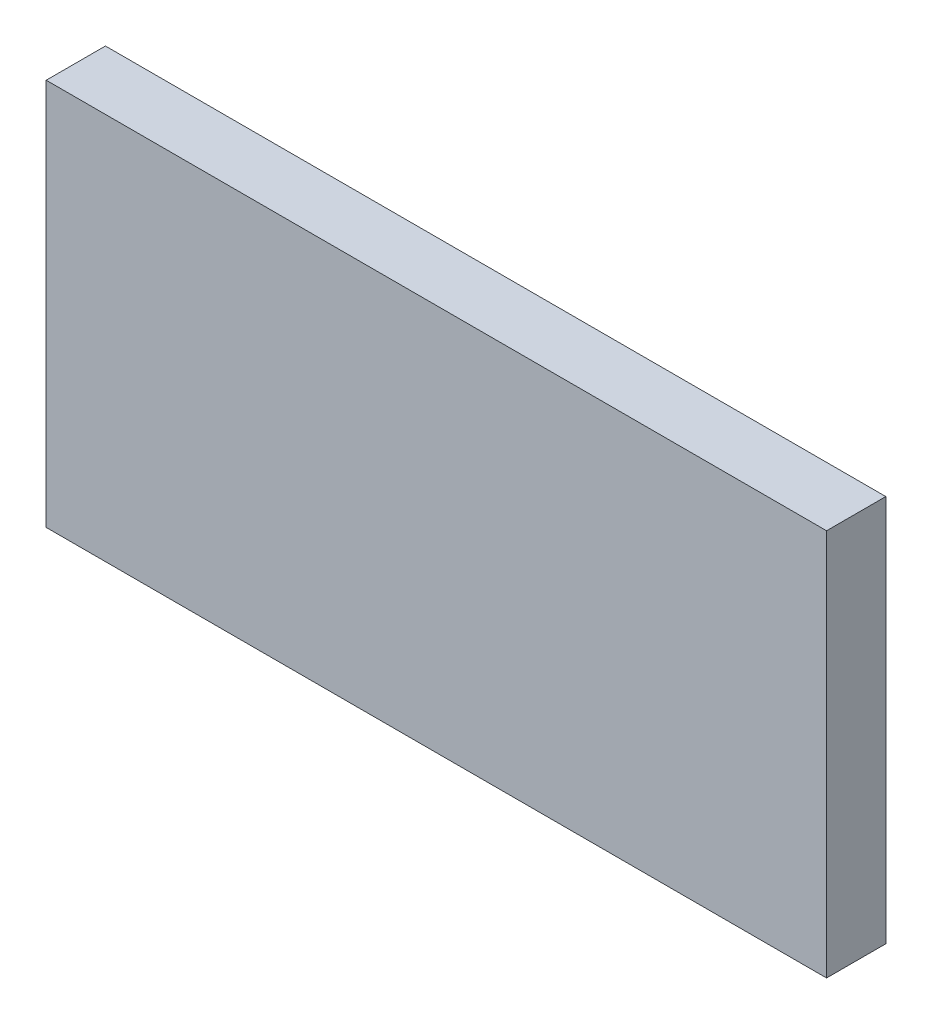
ISO-10303-21;
HEADER;
FILE_DESCRIPTION(('STEP AP214'),'2;1');
FILE_NAME('part.step','',(''),(''),'','','');
FILE_SCHEMA(('AUTOMOTIVE_DESIGN { 1 0 10303 214 1 1 1 1 }'));
ENDSEC;
DATA;
#1=APPLICATION_CONTEXT('core data for automotive mechanical design processes');
#2=APPLICATION_PROTOCOL_DEFINITION('international standard','automotive_design',2000,#1);
#3=PRODUCT_CONTEXT('',#1,'mechanical');
#4=PRODUCT('Part','Part','',(#3));
#5=PRODUCT_RELATED_PRODUCT_CATEGORY('part','',(#4));
#6=PRODUCT_DEFINITION_FORMATION('','',#4);
#7=PRODUCT_DEFINITION_CONTEXT('part definition',#1,'design');
#8=PRODUCT_DEFINITION('design','',#6,#7);
#9=PRODUCT_DEFINITION_SHAPE('','',#8);
#10=(LENGTH_UNIT() NAMED_UNIT(*) SI_UNIT(.MILLI.,.METRE.));
#11=(NAMED_UNIT(*) PLANE_ANGLE_UNIT() SI_UNIT($,.RADIAN.));
#12=(NAMED_UNIT(*) SI_UNIT($,.STERADIAN.) SOLID_ANGLE_UNIT());
#13=UNCERTAINTY_MEASURE_WITH_UNIT(LENGTH_MEASURE(1.E-05),#10,'distance_accuracy_value','');
#14=(GEOMETRIC_REPRESENTATION_CONTEXT(3) GLOBAL_UNCERTAINTY_ASSIGNED_CONTEXT((#13)) GLOBAL_UNIT_ASSIGNED_CONTEXT((#10,
#11,#12)) REPRESENTATION_CONTEXT('',''));
#15=CARTESIAN_POINT('',(0.,0.,0.));
#16=DIRECTION('',(0.,0.,1.));
#17=DIRECTION('',(1.,0.,0.));
#18=AXIS2_PLACEMENT_3D('',#15,#16,#17);
#19=CARTESIAN_POINT('',(-5.44478880066146,2.88779220779221,10.4));
#20=DIRECTION('',(1.,0.,0.));
#21=DIRECTION('',(0.,1.,0.));
#22=AXIS2_PLACEMENT_3D('',#19,#20,#21);
#23=PLANE('',#22);
#24=DIRECTION('',(0.,-1.,0.));
#25=VECTOR('',#24,1.);
#26=CARTESIAN_POINT('',(-5.44478880066146,2.88779220779221,0.));
#27=LINE('',#26,#25);
#28=CARTESIAN_POINT('',(-5.44478880066146,2.88779220779221,0.));
#29=VERTEX_POINT('',#28);
#30=CARTESIAN_POINT('',(-5.44478880066146,-65.1122077922078,0.));
#31=VERTEX_POINT('',#30);
#32=EDGE_CURVE('E96',#29,#31,#27,.T.);
#33=ORIENTED_EDGE('',*,*,#32,.T.);
#34=DIRECTION('',(0.,0.,-1.));
#35=VECTOR('',#34,1.);
#36=CARTESIAN_POINT('',(-5.44478880066146,-65.1122077922078,10.4));
#37=LINE('',#36,#35);
#38=CARTESIAN_POINT('',(-5.44478880066146,-65.1122077922078,10.4));
#39=VERTEX_POINT('',#38);
#40=EDGE_CURVE('E11',#39,#31,#37,.T.);
#41=ORIENTED_EDGE('',*,*,#40,.F.);
#42=DIRECTION('',(0.,-1.,0.));
#43=VECTOR('',#42,1.);
#44=CARTESIAN_POINT('',(-5.44478880066146,2.88779220779221,10.4));
#45=LINE('',#44,#43);
#46=CARTESIAN_POINT('',(-5.44478880066146,2.88779220779221,10.4));
#47=VERTEX_POINT('',#46);
#48=EDGE_CURVE('E84',#47,#39,#45,.T.);
#49=ORIENTED_EDGE('',*,*,#48,.F.);
#50=DIRECTION('',(0.,0.,-1.));
#51=VECTOR('',#50,1.);
#52=CARTESIAN_POINT('',(-5.44478880066146,2.88779220779221,10.4));
#53=LINE('',#52,#51);
#54=EDGE_CURVE('E92',#47,#29,#53,.T.);
#55=ORIENTED_EDGE('',*,*,#54,.T.);
#56=EDGE_LOOP('',(#33,#41,#49,#55));
#57=FACE_BOUND('',#56,.T.);
#58=ADVANCED_FACE('F33',(#57),#23,.F.);
#59=CARTESIAN_POINT('',(-5.44478880066146,-65.1122077922078,10.4));
#60=DIRECTION('',(0.,1.,0.));
#61=DIRECTION('',(0.,0.,1.));
#62=AXIS2_PLACEMENT_3D('',#59,#60,#61);
#63=PLANE('',#62);
#64=DIRECTION('',(1.,0.,0.));
#65=VECTOR('',#64,1.);
#66=CARTESIAN_POINT('',(-5.44478880066146,-65.1122077922078,0.));
#67=LINE('',#66,#65);
#68=CARTESIAN_POINT('',(131.555211199339,-65.1122077922078,0.));
#69=VERTEX_POINT('',#68);
#70=EDGE_CURVE('E88',#31,#69,#67,.T.);
#71=ORIENTED_EDGE('',*,*,#70,.T.);
#72=DIRECTION('',(0.,0.,-1.));
#73=VECTOR('',#72,1.);
#74=CARTESIAN_POINT('',(131.555211199339,-65.1122077922078,10.4));
#75=LINE('',#74,#73);
#76=CARTESIAN_POINT('',(131.555211199339,-65.1122077922078,10.4));
#77=VERTEX_POINT('',#76);
#78=EDGE_CURVE('E41',#77,#69,#75,.T.);
#79=ORIENTED_EDGE('',*,*,#78,.F.);
#80=DIRECTION('',(1.,0.,0.));
#81=VECTOR('',#80,1.);
#82=CARTESIAN_POINT('',(-5.44478880066146,-65.1122077922078,10.4));
#83=LINE('',#82,#81);
#84=EDGE_CURVE('E79',#39,#77,#83,.T.);
#85=ORIENTED_EDGE('',*,*,#84,.F.);
#86=ORIENTED_EDGE('',*,*,#40,.T.);
#87=EDGE_LOOP('',(#71,#79,#85,#86));
#88=FACE_BOUND('',#87,.T.);
#89=ADVANCED_FACE('F87',(#88),#63,.F.);
#90=CARTESIAN_POINT('',(131.555211199339,2.88779220779221,10.4));
#91=DIRECTION('',(-1.,0.,0.));
#92=DIRECTION('',(0.,0.,1.));
#93=AXIS2_PLACEMENT_3D('',#90,#91,#92);
#94=PLANE('',#93);
#95=DIRECTION('',(0.,1.,0.));
#96=VECTOR('',#95,1.);
#97=CARTESIAN_POINT('',(131.555211199339,2.88779220779221,0.));
#98=LINE('',#97,#96);
#99=CARTESIAN_POINT('',(131.555211199339,2.88779220779221,0.));
#100=VERTEX_POINT('',#99);
#101=EDGE_CURVE('E66',#69,#100,#98,.T.);
#102=ORIENTED_EDGE('',*,*,#101,.T.);
#103=DIRECTION('',(0.,0.,-1.));
#104=VECTOR('',#103,1.);
#105=CARTESIAN_POINT('',(131.555211199339,2.88779220779221,10.4));
#106=LINE('',#105,#104);
#107=CARTESIAN_POINT('',(131.555211199339,2.88779220779221,10.4));
#108=VERTEX_POINT('',#107);
#109=EDGE_CURVE('E89',#108,#100,#106,.T.);
#110=ORIENTED_EDGE('',*,*,#109,.F.);
#111=DIRECTION('',(0.,1.,0.));
#112=VECTOR('',#111,1.);
#113=CARTESIAN_POINT('',(131.555211199339,2.88779220779221,10.4));
#114=LINE('',#113,#112);
#115=EDGE_CURVE('E82',#77,#108,#114,.T.);
#116=ORIENTED_EDGE('',*,*,#115,.F.);
#117=ORIENTED_EDGE('',*,*,#78,.T.);
#118=EDGE_LOOP('',(#102,#110,#116,#117));
#119=FACE_BOUND('',#118,.T.);
#120=ADVANCED_FACE('F90',(#119),#94,.F.);
#121=CARTESIAN_POINT('',(-5.44478880066146,2.88779220779221,10.4));
#122=DIRECTION('',(0.,-1.,0.));
#123=DIRECTION('',(0.,0.,-1.));
#124=AXIS2_PLACEMENT_3D('',#121,#122,#123);
#125=PLANE('',#124);
#126=DIRECTION('',(-1.,0.,0.));
#127=VECTOR('',#126,1.);
#128=CARTESIAN_POINT('',(-5.44478880066146,2.88779220779221,0.));
#129=LINE('',#128,#127);
#130=EDGE_CURVE('E72',#100,#29,#129,.T.);
#131=ORIENTED_EDGE('',*,*,#130,.T.);
#132=ORIENTED_EDGE('',*,*,#54,.F.);
#133=DIRECTION('',(-1.,0.,0.));
#134=VECTOR('',#133,1.);
#135=CARTESIAN_POINT('',(-5.44478880066146,2.88779220779221,10.4));
#136=LINE('',#135,#134);
#137=EDGE_CURVE('E49',#108,#47,#136,.T.);
#138=ORIENTED_EDGE('',*,*,#137,.F.);
#139=ORIENTED_EDGE('',*,*,#109,.T.);
#140=EDGE_LOOP('',(#131,#132,#138,#139));
#141=FACE_BOUND('',#140,.T.);
#142=ADVANCED_FACE('F103',(#141),#125,.F.);
#143=CARTESIAN_POINT('',(0.,0.,10.4));
#144=DIRECTION('',(0.,0.,1.));
#145=DIRECTION('',(1.,0.,0.));
#146=AXIS2_PLACEMENT_3D('',#143,#144,#145);
#147=PLANE('',#146);
#148=ORIENTED_EDGE('',*,*,#48,.T.);
#149=ORIENTED_EDGE('',*,*,#84,.T.);
#150=ORIENTED_EDGE('',*,*,#115,.T.);
#151=ORIENTED_EDGE('',*,*,#137,.T.);
#152=EDGE_LOOP('',(#148,#149,#150,#151));
#153=FACE_BOUND('',#152,.T.);
#154=ADVANCED_FACE('F80',(#153),#147,.T.);
#155=CARTESIAN_POINT('',(0.,0.,0.));
#156=DIRECTION('',(0.,0.,1.));
#157=DIRECTION('',(1.,0.,0.));
#158=AXIS2_PLACEMENT_3D('',#155,#156,#157);
#159=PLANE('',#158);
#160=ORIENTED_EDGE('',*,*,#32,.F.);
#161=ORIENTED_EDGE('',*,*,#130,.F.);
#162=ORIENTED_EDGE('',*,*,#101,.F.);
#163=ORIENTED_EDGE('',*,*,#70,.F.);
#164=EDGE_LOOP('',(#160,#161,#162,#163));
#165=FACE_BOUND('',#164,.T.);
#166=ADVANCED_FACE('F106',(#165),#159,.F.);
#167=CLOSED_SHELL('',(#58,#89,#120,#142,#154,#166));
#168=MANIFOLD_SOLID_BREP('B2',#167);
#169=ADVANCED_BREP_SHAPE_REPRESENTATION('',(#18,#168),#14);
#170=SHAPE_DEFINITION_REPRESENTATION(#9,#169);
ENDSEC;
END-ISO-10303-21;
